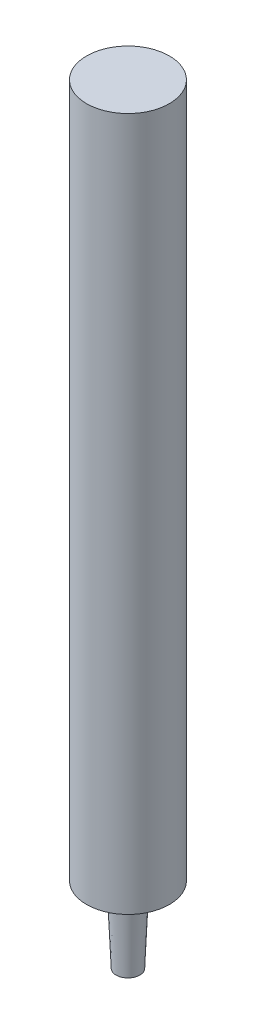
ISO-10303-21;
HEADER;
FILE_DESCRIPTION(('STEP AP214'),'2;1');
FILE_NAME('part.step','',(''),(''),'','','');
FILE_SCHEMA(('AUTOMOTIVE_DESIGN { 1 0 10303 214 1 1 1 1 }'));
ENDSEC;
DATA;
#1=APPLICATION_CONTEXT('core data for automotive mechanical design processes');
#2=APPLICATION_PROTOCOL_DEFINITION('international standard','automotive_design',2000,#1);
#3=PRODUCT_CONTEXT('',#1,'mechanical');
#4=PRODUCT('Part','Part','',(#3));
#5=PRODUCT_RELATED_PRODUCT_CATEGORY('part','',(#4));
#6=PRODUCT_DEFINITION_FORMATION('','',#4);
#7=PRODUCT_DEFINITION_CONTEXT('part definition',#1,'design');
#8=PRODUCT_DEFINITION('design','',#6,#7);
#9=PRODUCT_DEFINITION_SHAPE('','',#8);
#10=(LENGTH_UNIT() NAMED_UNIT(*) SI_UNIT(.MILLI.,.METRE.));
#11=(NAMED_UNIT(*) PLANE_ANGLE_UNIT() SI_UNIT($,.RADIAN.));
#12=(NAMED_UNIT(*) SI_UNIT($,.STERADIAN.) SOLID_ANGLE_UNIT());
#13=UNCERTAINTY_MEASURE_WITH_UNIT(LENGTH_MEASURE(1.E-05),#10,'distance_accuracy_value','');
#14=(GEOMETRIC_REPRESENTATION_CONTEXT(3) GLOBAL_UNCERTAINTY_ASSIGNED_CONTEXT((#13)) GLOBAL_UNIT_ASSIGNED_CONTEXT((#10,
#11,#12)) REPRESENTATION_CONTEXT('',''));
#15=CARTESIAN_POINT('',(0.,0.,0.));
#16=DIRECTION('',(0.,0.,1.));
#17=DIRECTION('',(1.,0.,0.));
#18=AXIS2_PLACEMENT_3D('',#15,#16,#17);
#19=CARTESIAN_POINT('',(0.,-61.105,0.));
#20=DIRECTION('',(0.,1.,0.));
#21=DIRECTION('',(0.,0.,1.));
#22=AXIS2_PLACEMENT_3D('',#19,#20,#21);
#23=PLANE('',#22);
#24=CARTESIAN_POINT('',(0.,-61.105,0.));
#25=DIRECTION('',(0.,1.,0.));
#26=DIRECTION('',(0.,0.,1.));
#27=AXIS2_PLACEMENT_3D('',#24,#25,#26);
#28=CIRCLE('',#27,2.835);
#29=CARTESIAN_POINT('',(0.,-61.105,2.835));
#30=VERTEX_POINT('',#29);
#31=EDGE_CURVE('E10',#30,#30,#28,.T.);
#32=ORIENTED_EDGE('',*,*,#31,.F.);
#33=EDGE_LOOP('',(#32));
#34=FACE_BOUND('',#33,.T.);
#35=ADVANCED_FACE('F36',(#34),#23,.F.);
#36=CARTESIAN_POINT('',(0.,-46.8135,0.));
#37=DIRECTION('',(0.,1.,0.));
#38=DIRECTION('',(0.,0.,1.));
#39=AXIS2_PLACEMENT_3D('',#36,#37,#38);
#40=CONICAL_SURFACE('',#39,3.43875,0.0422202860902761);
#41=CARTESIAN_POINT('',(0.,-46.8135,0.));
#42=DIRECTION('',(0.,1.,0.));
#43=DIRECTION('',(0.,0.,1.));
#44=AXIS2_PLACEMENT_3D('',#41,#42,#43);
#45=CIRCLE('',#44,3.43875);
#46=CARTESIAN_POINT('',(0.,-46.8135,3.43875));
#47=VERTEX_POINT('',#46);
#48=EDGE_CURVE('E44',#47,#47,#45,.T.);
#49=ORIENTED_EDGE('',*,*,#48,.F.);
#50=EDGE_LOOP('',(#49));
#51=FACE_BOUND('',#50,.T.);
#52=ORIENTED_EDGE('',*,*,#31,.T.);
#53=EDGE_LOOP('',(#52));
#54=FACE_BOUND('',#53,.T.);
#55=ADVANCED_FACE('F65',(#51,#54),#40,.T.);
#56=CARTESIAN_POINT('',(0.,-42.925,0.));
#57=DIRECTION('',(0.,1.,0.));
#58=DIRECTION('',(-1.,0.,0.));
#59=AXIS2_PLACEMENT_3D('',#56,#57,#58);
#60=CONICAL_SURFACE('',#59,9.912,1.02986015394201);
#61=CARTESIAN_POINT('',(0.,-42.925,0.));
#62=DIRECTION('',(0.,1.,0.));
#63=DIRECTION('',(0.,0.,1.));
#64=AXIS2_PLACEMENT_3D('',#61,#62,#63);
#65=CIRCLE('',#64,9.912);
#66=CARTESIAN_POINT('',(0.,-42.925,9.912));
#67=VERTEX_POINT('',#66);
#68=EDGE_CURVE('E49',#67,#67,#65,.T.);
#69=ORIENTED_EDGE('',*,*,#68,.F.);
#70=EDGE_LOOP('',(#69));
#71=FACE_BOUND('',#70,.T.);
#72=ORIENTED_EDGE('',*,*,#48,.T.);
#73=EDGE_LOOP('',(#72));
#74=FACE_BOUND('',#73,.T.);
#75=ADVANCED_FACE('F60',(#71,#74),#60,.T.);
#76=CARTESIAN_POINT('',(0.,61.105,0.));
#77=DIRECTION('',(0.,1.,0.));
#78=DIRECTION('',(0.,0.,1.));
#79=AXIS2_PLACEMENT_3D('',#76,#77,#78);
#80=CYLINDRICAL_SURFACE('',#79,9.912);
#81=ORIENTED_EDGE('',*,*,#68,.T.);
#82=EDGE_LOOP('',(#81));
#83=FACE_BOUND('',#82,.T.);
#84=CARTESIAN_POINT('',(0.,123.22,0.));
#85=DIRECTION('',(0.,1.,0.));
#86=DIRECTION('',(0.,0.,1.));
#87=AXIS2_PLACEMENT_3D('',#84,#85,#86);
#88=CIRCLE('',#87,9.912);
#89=CARTESIAN_POINT('',(0.,123.22,9.912));
#90=VERTEX_POINT('',#89);
#91=EDGE_CURVE('E40',#90,#90,#88,.T.);
#92=ORIENTED_EDGE('',*,*,#91,.F.);
#93=EDGE_LOOP('',(#92));
#94=FACE_BOUND('',#93,.T.);
#95=ADVANCED_FACE('F58',(#83,#94),#80,.T.);
#96=CARTESIAN_POINT('',(0.,123.22,0.));
#97=DIRECTION('',(0.,1.,0.));
#98=DIRECTION('',(0.,0.,1.));
#99=AXIS2_PLACEMENT_3D('',#96,#97,#98);
#100=PLANE('',#99);
#101=ORIENTED_EDGE('',*,*,#91,.T.);
#102=EDGE_LOOP('',(#101));
#103=FACE_BOUND('',#102,.T.);
#104=ADVANCED_FACE('F38',(#103),#100,.T.);
#105=CLOSED_SHELL('',(#35,#55,#75,#95,#104));
#106=MANIFOLD_SOLID_BREP('B2',#105);
#107=ADVANCED_BREP_SHAPE_REPRESENTATION('',(#18,#106),#14);
#108=SHAPE_DEFINITION_REPRESENTATION(#9,#107);
ENDSEC;
END-ISO-10303-21;
